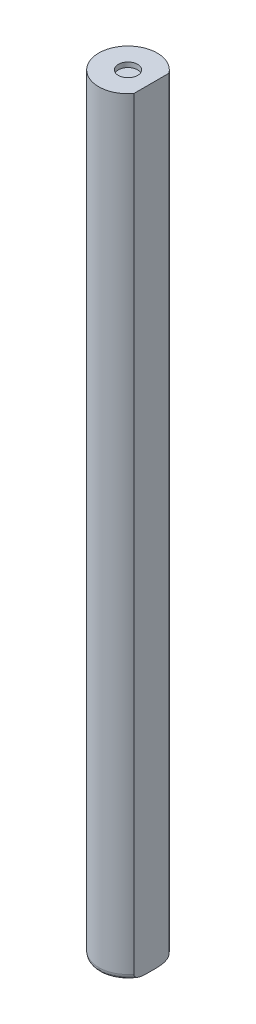
ISO-10303-21;
HEADER;
FILE_DESCRIPTION(('STEP AP214'),'2;1');
FILE_NAME('part.step','',(''),(''),'','','');
FILE_SCHEMA(('AUTOMOTIVE_DESIGN { 1 0 10303 214 1 1 1 1 }'));
ENDSEC;
DATA;
#1=APPLICATION_CONTEXT('core data for automotive mechanical design processes');
#2=APPLICATION_PROTOCOL_DEFINITION('international standard','automotive_design',2000,#1);
#3=PRODUCT_CONTEXT('',#1,'mechanical');
#4=PRODUCT('Part','Part','',(#3));
#5=PRODUCT_RELATED_PRODUCT_CATEGORY('part','',(#4));
#6=PRODUCT_DEFINITION_FORMATION('','',#4);
#7=PRODUCT_DEFINITION_CONTEXT('part definition',#1,'design');
#8=PRODUCT_DEFINITION('design','',#6,#7);
#9=PRODUCT_DEFINITION_SHAPE('','',#8);
#10=(LENGTH_UNIT() NAMED_UNIT(*) SI_UNIT(.MILLI.,.METRE.));
#11=(NAMED_UNIT(*) PLANE_ANGLE_UNIT() SI_UNIT($,.RADIAN.));
#12=(NAMED_UNIT(*) SI_UNIT($,.STERADIAN.) SOLID_ANGLE_UNIT());
#13=UNCERTAINTY_MEASURE_WITH_UNIT(LENGTH_MEASURE(1.E-05),#10,'distance_accuracy_value','');
#14=(GEOMETRIC_REPRESENTATION_CONTEXT(3) GLOBAL_UNCERTAINTY_ASSIGNED_CONTEXT((#13)) GLOBAL_UNIT_ASSIGNED_CONTEXT((#10,
#11,#12)) REPRESENTATION_CONTEXT('',''));
#15=CARTESIAN_POINT('',(0.,0.,0.));
#16=DIRECTION('',(0.,0.,1.));
#17=DIRECTION('',(1.,0.,0.));
#18=AXIS2_PLACEMENT_3D('',#15,#16,#17);
#19=CARTESIAN_POINT('',(-0.8349,30.15,-0.8349));
#20=DIRECTION('',(0.,1.,0.));
#21=DIRECTION('',(0.,0.,1.));
#22=AXIS2_PLACEMENT_3D('',#19,#20,#21);
#23=PLANE('',#22);
#24=CARTESIAN_POINT('',(0.,30.15,0.));
#25=DIRECTION('',(0.,1.,0.));
#26=DIRECTION('',(-1.,0.,0.));
#27=AXIS2_PLACEMENT_3D('',#24,#25,#26);
#28=CIRCLE('',#27,0.825);
#29=CARTESIAN_POINT('',(-0.825,30.15,0.));
#30=VERTEX_POINT('',#29);
#31=EDGE_CURVE('E21',#30,#30,#28,.F.);
#32=ORIENTED_EDGE('',*,*,#31,.F.);
#33=EDGE_LOOP('',(#32));
#34=FACE_BOUND('',#33,.T.);
#35=ADVANCED_FACE('F17',(#34),#23,.T.);
#36=CARTESIAN_POINT('',(-0.8349,-30.15,0.8349));
#37=DIRECTION('',(0.,-1.,0.));
#38=DIRECTION('',(0.,0.,-1.));
#39=AXIS2_PLACEMENT_3D('',#36,#37,#38);
#40=PLANE('',#39);
#41=CARTESIAN_POINT('',(0.,-30.15,0.));
#42=DIRECTION('',(0.,-1.,0.));
#43=DIRECTION('',(1.,0.,0.));
#44=AXIS2_PLACEMENT_3D('',#41,#42,#43);
#45=CIRCLE('',#44,0.825);
#46=CARTESIAN_POINT('',(0.825,-30.15,0.));
#47=VERTEX_POINT('',#46);
#48=EDGE_CURVE('E69',#47,#47,#45,.F.);
#49=ORIENTED_EDGE('',*,*,#48,.F.);
#50=EDGE_LOOP('',(#49));
#51=FACE_BOUND('',#50,.T.);
#52=ADVANCED_FACE('F234',(#51),#40,.T.);
#53=CARTESIAN_POINT('',(0.,30.15,0.));
#54=DIRECTION('',(0.,1.,0.));
#55=DIRECTION('',(-1.,0.,0.));
#56=AXIS2_PLACEMENT_3D('',#53,#54,#55);
#57=CYLINDRICAL_SURFACE('',#56,0.825);
#58=ORIENTED_EDGE('',*,*,#31,.T.);
#59=EDGE_LOOP('',(#58));
#60=FACE_BOUND('',#59,.T.);
#61=CARTESIAN_POINT('',(0.,30.564087739,0.));
#62=DIRECTION('',(0.,1.,0.));
#63=DIRECTION('',(-1.,0.,0.));
#64=AXIS2_PLACEMENT_3D('',#61,#62,#63);
#65=CIRCLE('',#64,0.825);
#66=CARTESIAN_POINT('',(-0.824999999999999,30.564087739,0.));
#67=VERTEX_POINT('',#66);
#68=EDGE_CURVE('E129',#67,#67,#65,.T.);
#69=ORIENTED_EDGE('',*,*,#68,.T.);
#70=EDGE_LOOP('',(#69));
#71=FACE_BOUND('',#70,.T.);
#72=ADVANCED_FACE('F228',(#60,#71),#57,.F.);
#73=CARTESIAN_POINT('',(2.,-35.565071166,-1.5));
#74=DIRECTION('',(-1.,0.,0.));
#75=DIRECTION('',(0.,0.,1.));
#76=AXIS2_PLACEMENT_3D('',#73,#74,#75);
#77=PLANE('',#76);
#78=DIRECTION('',(0.,0.,1.));
#79=VECTOR('',#78,1.);
#80=CARTESIAN_POINT('',(2.,30.564087739,0.));
#81=LINE('',#80,#79);
#82=CARTESIAN_POINT('',(1.99999999999879,30.564087739,-1.50000000000161));
#83=VERTEX_POINT('',#82);
#84=CARTESIAN_POINT('',(1.99999999969114,30.564087739,1.50000000041182));
#85=VERTEX_POINT('',#84);
#86=EDGE_CURVE('E132',#83,#85,#81,.T.);
#87=ORIENTED_EDGE('',*,*,#86,.T.);
#88=DIRECTION('',(0.,1.,0.));
#89=VECTOR('',#88,1.);
#90=CARTESIAN_POINT('',(1.99999999938227,-2.0429561305,1.50000000082364));
#91=LINE('',#90,#89);
#92=CARTESIAN_POINT('',(1.99999999969114,-34.650000000277,1.5000000004299));
#93=VERTEX_POINT('',#92);
#94=EDGE_CURVE('E57',#85,#93,#91,.F.);
#95=ORIENTED_EDGE('',*,*,#94,.T.);
#96=CARTESIAN_POINT('',(2.,-35.15,0.));
#97=CARTESIAN_POINT('',(2.,-35.1499973748319,0.0265296691538286));
#98=CARTESIAN_POINT('',(2.,-35.150000350175,0.0530592825620455));
#99=CARTESIAN_POINT('',(2.,-35.1499946381844,0.106118772319396));
#100=CARTESIAN_POINT('',(2.,-35.1499859507339,0.132648648668499));
#101=CARTESIAN_POINT('',(2.,-35.1499075649639,0.212782874046923));
#102=CARTESIAN_POINT('',(2.,-35.1497846514025,0.266387385882318));
#103=CARTESIAN_POINT('',(2.,-35.1489184940871,0.373837047202513));
#104=CARTESIAN_POINT('',(2.,-35.1481724270548,0.427682180514275));
#105=CARTESIAN_POINT('',(2.,-35.1451560814967,0.539742722369725));
#106=CARTESIAN_POINT('',(2.,-35.1427662842343,0.597955864954052));
#107=CARTESIAN_POINT('',(2.,-35.1350097758184,0.713977971346417));
#108=CARTESIAN_POINT('',(2.,-35.1296544792164,0.771787629540953));
#109=CARTESIAN_POINT('',(2.,-35.1142622637153,0.886672370363475));
#110=CARTESIAN_POINT('',(2.,-35.1042407692992,0.94374924129938));
#111=CARTESIAN_POINT('',(2.,-35.0849399763858,1.02430218548419));
#112=CARTESIAN_POINT('',(2.00000000000001,-35.0784719335315,1.04845017570847));
#113=CARTESIAN_POINT('',(1.99999999999999,-35.0640113210926,1.09631140173867));
#114=CARTESIAN_POINT('',(1.99999999999997,-35.0560176594493,1.1200243126995));
#115=CARTESIAN_POINT('',(2.00000000000003,-35.0383620986888,1.16653041887575));
#116=CARTESIAN_POINT('',(2.0000000000001,-35.028719547115,1.18933086810563));
#117=CARTESIAN_POINT('',(1.9999999999999,-35.0074519855615,1.23397503342595));
#118=CARTESIAN_POINT('',(1.99999999999964,-34.9958287901944,1.25581960244793));
#119=CARTESIAN_POINT('',(1.99999999999962,-34.9697407837417,1.29911839128748));
#120=CARTESIAN_POINT('',(1.9999999999999,-34.9551715345356,1.32051067565466));
#121=CARTESIAN_POINT('',(2.0000000000001,-34.923243238202,1.3611639730037));
#122=CARTESIAN_POINT('',(2.00000000000002,-34.9058832492352,1.38042426274581));
#123=CARTESIAN_POINT('',(1.99999999999998,-34.8712605713702,1.41296218592201));
#124=CARTESIAN_POINT('',(1.99999999999999,-34.8544380370302,1.4267035275781));
#125=CARTESIAN_POINT('',(2.00000000000001,-34.8187659687525,1.4512668021174));
#126=CARTESIAN_POINT('',(2.,-34.7999187954989,1.46209208447374));
#127=CARTESIAN_POINT('',(1.99999999999999,-34.7641043849037,1.47839993924313));
#128=CARTESIAN_POINT('',(1.99999999999999,-34.7474173324115,1.48449575367811));
#129=CARTESIAN_POINT('',(2.00000000000001,-34.7132761960652,1.49379443620461));
#130=CARTESIAN_POINT('',(2.00000000000004,-34.6958239919873,1.49700401855121));
#131=CARTESIAN_POINT('',(1.99999999999998,-34.6688501515603,1.49955870939121));
#132=CARTESIAN_POINT('',(1.99999999999995,-34.6594235919852,1.50000777377347));
#133=CARTESIAN_POINT('',(1.99999999999988,-34.6500000005539,1.50000000003623));
#134=B_SPLINE_CURVE_WITH_KNOTS('',3,(#96,#97,#98,#99,#100,#101,#102,#103,#104,#105,#106,#107,
#108,#109,#110,#111,#112,#113,#114,#115,#116,#117,#118,#119,#120,#121,#122,#123,#124,#125,#126,
#127,#128,#129,#130,#131,#132,#133),.UNSPECIFIED.,.F.,.F.,(4,2,2,2,2,2,2,2,2,2,2,2,2,2,2,2,2,2,
4),(0.,0.0795888945441585,0.159178586704959,0.319991282718455,0.481536538844484,
0.656276652448952,0.830348799826878,1.0038495791647,1.0788076496339,1.15381957872368,
1.22800516865121,1.30212315360286,1.37958067575754,1.45706439393586,1.52199124205137,
1.5868431921278,1.63991765483916,1.69286832836304,1.72113845899334),.UNSPECIFIED.);
#135=CARTESIAN_POINT('',(1.9999999996251,-35.1499999984148,0.));
#136=VERTEX_POINT('',#135);
#137=EDGE_CURVE('E60',#136,#93,#134,.T.);
#138=ORIENTED_EDGE('',*,*,#137,.F.);
#139=CARTESIAN_POINT('',(2.,-34.6500000005539,-1.50000000003615));
#140=CARTESIAN_POINT('',(2.,-34.6599948327778,-1.50000228650955));
#141=CARTESIAN_POINT('',(2.,-34.6699828286215,-1.4995000445694));
#142=CARTESIAN_POINT('',(2.,-34.6898511505919,-1.49751290791094));
#143=CARTESIAN_POINT('',(2.,-34.6997315711314,-1.49602895983524));
#144=CARTESIAN_POINT('',(2.,-34.7288852872338,-1.49018557466679));
#145=CARTESIAN_POINT('',(2.,-34.7478933742187,-1.48443328458527));
#146=CARTESIAN_POINT('',(2.,-34.7845021945256,-1.46971009500002));
#147=CARTESIAN_POINT('',(2.,-34.8021076658047,-1.46075064642023));
#148=CARTESIAN_POINT('',(2.,-34.8357413554394,-1.44019068427704));
#149=CARTESIAN_POINT('',(2.,-34.8517651739187,-1.42858308507846));
#150=CARTESIAN_POINT('',(2.,-34.8889335087197,-1.39760918244545));
#151=CARTESIAN_POINT('',(2.,-34.9091256667766,-1.37710543687427));
#152=CARTESIAN_POINT('',(2.,-34.9460210343716,-1.33321406001512));
#153=CARTESIAN_POINT('',(2.,-34.9627204075466,-1.30982330208332));
#154=CARTESIAN_POINT('',(2.,-34.9901996291985,-1.26567928594746));
#155=CARTESIAN_POINT('',(2.,-35.001502782732,-1.24524457623084));
#156=CARTESIAN_POINT('',(2.,-35.0222995510373,-1.20346308467402));
#157=CARTESIAN_POINT('',(2.,-35.0317917925876,-1.18211562558944));
#158=CARTESIAN_POINT('',(2.,-35.0492633250028,-1.13858465747921));
#159=CARTESIAN_POINT('',(2.,-35.0572275462186,-1.11639517348735));
#160=CARTESIAN_POINT('',(2.,-35.071736136908,-1.07158076059455));
#161=CARTESIAN_POINT('',(2.,-35.0782815321358,-1.04895615923645));
#162=CARTESIAN_POINT('',(2.,-35.0992109347844,-0.968677769395449));
#163=CARTESIAN_POINT('',(2.,-35.1103424464791,-0.910176666887891));
#164=CARTESIAN_POINT('',(2.,-35.1274374222635,-0.792295550748619));
#165=CARTESIAN_POINT('',(2.,-35.1333805438064,-0.732912997730389));
#166=CARTESIAN_POINT('',(2.,-35.1419892062176,-0.613661710079348));
#167=CARTESIAN_POINT('',(2.,-35.1446398008429,-0.553791991269906));
#168=CARTESIAN_POINT('',(2.,-35.1479803344867,-0.43862620006697));
#169=CARTESIAN_POINT('',(2.,-35.1488055109526,-0.383332871621076));
#170=CARTESIAN_POINT('',(2.,-35.1497626032388,-0.273037301993217));
#171=CARTESIAN_POINT('',(2.,-35.1498981990641,-0.218035083794488));
#172=CARTESIAN_POINT('',(2.,-35.1499845384152,-0.135860741575506));
#173=CARTESIAN_POINT('',(2.,-35.1499940985568,-0.108688416277926));
#174=CARTESIAN_POINT('',(2.,-35.1500003866772,-0.0543440834690096));
#175=CARTESIAN_POINT('',(2.,-35.1499971148076,-0.0271720759577138));
#176=CARTESIAN_POINT('',(2.,-35.15,0.));
#177=B_SPLINE_CURVE_WITH_KNOTS('',3,(#139,#140,#141,#142,#143,#144,#145,#146,#147,#148,#149,
#150,#151,#152,#153,#154,#155,#156,#157,#158,#159,#160,#161,#162,#163,#164,#165,#166,#167,#168,
#169,#170,#171,#172,#173,#174,#175,#176),.UNSPECIFIED.,.F.,.F.,(4,2,2,2,2,2,2,2,2,2,2,2,2,2,2,2,
2,2,4),(0.,0.0299590488165881,0.0598892506563785,0.11909413100987,0.178089699265009,
0.237245012345497,0.323095414919121,0.409039623301985,0.478999672042764,0.549012562708301,
0.619683954450262,0.690304081938238,0.868528073053722,1.04744774315994,1.2271766757427,
1.39306852483215,1.55807414220002,1.63959119524808,1.72110728454276),.UNSPECIFIED.);
#178=CARTESIAN_POINT('',(1.99999999999879,-34.650000000277,-1.50000000001969));
#179=VERTEX_POINT('',#178);
#180=EDGE_CURVE('E64',#179,#136,#177,.T.);
#181=ORIENTED_EDGE('',*,*,#180,.F.);
#182=DIRECTION('',(0.,-1.,0.));
#183=VECTOR('',#182,1.);
#184=CARTESIAN_POINT('',(1.99999999999758,-2.0429561305,-1.50000000000322));
#185=LINE('',#184,#183);
#186=EDGE_CURVE('E96',#179,#83,#185,.F.);
#187=ORIENTED_EDGE('',*,*,#186,.T.);
#188=EDGE_LOOP('',(#87,#95,#138,#181,#187));
#189=FACE_BOUND('',#188,.T.);
#190=ADVANCED_FACE('F62',(#189),#77,.F.);
#191=CARTESIAN_POINT('',(0.,-35.15,-2.));
#192=CARTESIAN_POINT('',(1.180346711,-35.15,-2.));
#193=CARTESIAN_POINT('',(2.011035515,-35.15,-1.161445012));
#194=CARTESIAN_POINT('',(1.999911174,-35.15,0.018849277));
#195=CARTESIAN_POINT('',(0.,-35.15,-2.292893219));
#196=CARTESIAN_POINT('',(1.353204485,-35.15,-2.292893219));
#197=CARTESIAN_POINT('',(2.305544848,-35.15,-1.331534695));
#198=CARTESIAN_POINT('',(2.292791385,-35.15,0.02160969));
#199=CARTESIAN_POINT('',(0.,-34.942893219,-2.5));
#200=CARTESIAN_POINT('',(1.475433389,-34.942893219,-2.5));
#201=CARTESIAN_POINT('',(2.513794394,-34.942893219,-1.451806264));
#202=CARTESIAN_POINT('',(2.499888968,-34.942893219,0.023561596));
#203=CARTESIAN_POINT('',(0.,-34.65,-2.5));
#204=CARTESIAN_POINT('',(1.475433389,-34.65,-2.5));
#205=CARTESIAN_POINT('',(2.513794394,-34.65,-1.451806264));
#206=CARTESIAN_POINT('',(2.499888968,-34.65,0.023561596));
#207=(BOUNDED_SURFACE() B_SPLINE_SURFACE(3,3,((#191,#192,#193,#194),(#195,#196,#197,#198),(#199,
#200,#201,#202),(#203,#204,#205,#206)),.UNSPECIFIED.,.F.,.F.,
.F.) B_SPLINE_SURFACE_WITH_KNOTS((4,4),(4,4),(0.,1.),(0.,1.),
.UNSPECIFIED.) GEOMETRIC_REPRESENTATION_ITEM() RATIONAL_B_SPLINE_SURFACE(((1.,0.802511186738594,
0.802511186738594,1.),(0.804737854124365,0.645811130326813,0.645811130326813,0.804737854124365),
(0.804737854124365,0.645811130326813,0.645811130326813,0.804737854124365),(1.,0.802511186738594,
0.802511186738594,1.))) REPRESENTATION_ITEM('') SURFACE());
#208=CARTESIAN_POINT('',(0.,-34.65,0.));
#209=DIRECTION('',(0.,-1.,0.));
#210=DIRECTION('',(0.,0.,-1.));
#211=AXIS2_PLACEMENT_3D('',#208,#209,#210);
#212=CIRCLE('',#211,2.5);
#213=CARTESIAN_POINT('',(-2.24484071071833E-10,-34.65,-2.5));
#214=VERTEX_POINT('',#213);
#215=EDGE_CURVE('E77',#214,#179,#212,.T.);
#216=CARTESIAN_POINT('',(1.99991117400955,-35.15,0.0188492770000901));
#217=CARTESIAN_POINT('',(2.01103551500961,-35.15,-1.16144501200555));
#218=CARTESIAN_POINT('',(1.18034671100564,-35.15,-2.00000000000956));
#219=CARTESIAN_POINT('',(0.,-35.15,-2.00000000000956));
#220=(BOUNDED_CURVE() B_SPLINE_CURVE(3,(#216,#217,#218,#219),.UNSPECIFIED.,.F.,
.F.) B_SPLINE_CURVE_WITH_KNOTS((4,4),(0.,1.),
.UNSPECIFIED.) CURVE() GEOMETRIC_REPRESENTATION_ITEM() RATIONAL_B_SPLINE_CURVE((0.999999999992084,
0.802511186732241,0.802511186732241,0.999999999992084)) REPRESENTATION_ITEM(''));
#221=CARTESIAN_POINT('',(-6.83622602970502E-10,-35.15,-1.99999999958891));
#222=VERTEX_POINT('',#221);
#223=EDGE_CURVE('E74',#222,#136,#220,.F.);
#224=CARTESIAN_POINT('',(0.,-34.65,-2.));
#225=DIRECTION('',(1.,0.,0.));
#226=DIRECTION('',(0.,0.,-1.));
#227=AXIS2_PLACEMENT_3D('',#224,#225,#226);
#228=CIRCLE('',#227,0.5);
#229=EDGE_CURVE('E36',#222,#214,#228,.T.);
#230=ORIENTED_EDGE('',*,*,#215,.T.);
#231=ORIENTED_EDGE('',*,*,#180,.T.);
#232=ORIENTED_EDGE('',*,*,#223,.F.);
#233=ORIENTED_EDGE('',*,*,#229,.T.);
#234=EDGE_LOOP('',(#230,#231,#232,#233));
#235=FACE_BOUND('',#234,.T.);
#236=ADVANCED_FACE('F72',(#235),#207,.T.);
#237=CARTESIAN_POINT('',(1.999911174,-35.15,-0.018849277));
#238=CARTESIAN_POINT('',(2.011035515,-35.15,1.161445012));
#239=CARTESIAN_POINT('',(1.180346711,-35.15,2.));
#240=CARTESIAN_POINT('',(0.,-35.15,2.));
#241=CARTESIAN_POINT('',(2.292791385,-35.15,-0.02160969));
#242=CARTESIAN_POINT('',(2.305544848,-35.15,1.331534695));
#243=CARTESIAN_POINT('',(1.353204485,-35.15,2.292893219));
#244=CARTESIAN_POINT('',(0.,-35.15,2.292893219));
#245=CARTESIAN_POINT('',(2.499888968,-34.942893219,-0.023561596));
#246=CARTESIAN_POINT('',(2.513794394,-34.942893219,1.451806264));
#247=CARTESIAN_POINT('',(1.475433389,-34.942893219,2.5));
#248=CARTESIAN_POINT('',(0.,-34.942893219,2.5));
#249=CARTESIAN_POINT('',(2.499888968,-34.65,-0.023561596));
#250=CARTESIAN_POINT('',(2.513794394,-34.65,1.451806264));
#251=CARTESIAN_POINT('',(1.475433389,-34.65,2.5));
#252=CARTESIAN_POINT('',(0.,-34.65,2.5));
#253=(BOUNDED_SURFACE() B_SPLINE_SURFACE(3,3,((#237,#238,#239,#240),(#241,#242,#243,#244),(#245,
#246,#247,#248),(#249,#250,#251,#252)),.UNSPECIFIED.,.F.,.F.,
.F.) B_SPLINE_SURFACE_WITH_KNOTS((4,4),(4,4),(0.,1.),(0.,1.),
.UNSPECIFIED.) GEOMETRIC_REPRESENTATION_ITEM() RATIONAL_B_SPLINE_SURFACE(((1.,0.802511186738594,
0.802511186738594,1.),(0.804737854124365,0.645811130326813,0.645811130326813,0.804737854124365),
(0.804737854124365,0.645811130326813,0.645811130326813,0.804737854124365),(1.,0.802511186738594,
0.802511186738594,1.))) REPRESENTATION_ITEM('') SURFACE());
#254=CARTESIAN_POINT('',(0.,-34.65,0.));
#255=DIRECTION('',(0.,-1.,0.));
#256=DIRECTION('',(0.,0.,-1.));
#257=AXIS2_PLACEMENT_3D('',#254,#255,#256);
#258=CIRCLE('',#257,2.5);
#259=CARTESIAN_POINT('',(-6.4094821411041E-10,-34.65,2.5));
#260=VERTEX_POINT('',#259);
#261=EDGE_CURVE('E93',#93,#260,#258,.T.);
#262=CARTESIAN_POINT('',(0.,-34.65,2.));
#263=DIRECTION('',(1.,0.,0.));
#264=DIRECTION('',(0.,0.,-1.));
#265=AXIS2_PLACEMENT_3D('',#262,#263,#264);
#266=CIRCLE('',#265,0.5);
#267=CARTESIAN_POINT('',(-6.83622602970502E-10,-35.15,1.99999999959163));
#268=VERTEX_POINT('',#267);
#269=EDGE_CURVE('E70',#260,#268,#266,.T.);
#270=CARTESIAN_POINT('',(0.,-35.15,2.00000000002314));
#271=CARTESIAN_POINT('',(1.18034671101366,-35.15,2.00000000002314));
#272=CARTESIAN_POINT('',(2.01103551502327,-35.15,1.16144501201344));
#273=CARTESIAN_POINT('',(1.99991117402314,-35.15,-0.0188492770002181));
#274=(BOUNDED_CURVE() B_SPLINE_CURVE(3,(#270,#271,#272,#273),.UNSPECIFIED.,.F.,
.F.) B_SPLINE_CURVE_WITH_KNOTS((4,4),(0.,1.),
.UNSPECIFIED.) CURVE() GEOMETRIC_REPRESENTATION_ITEM() RATIONAL_B_SPLINE_CURVE((0.99999999998083,
0.80251118672321,0.80251118672321,0.99999999998083)) REPRESENTATION_ITEM(''));
#275=EDGE_CURVE('E82',#136,#268,#274,.F.);
#276=ORIENTED_EDGE('',*,*,#137,.T.);
#277=ORIENTED_EDGE('',*,*,#261,.T.);
#278=ORIENTED_EDGE('',*,*,#269,.T.);
#279=ORIENTED_EDGE('',*,*,#275,.F.);
#280=EDGE_LOOP('',(#276,#277,#278,#279));
#281=FACE_BOUND('',#280,.T.);
#282=ADVANCED_FACE('F84',(#281),#253,.T.);
#283=CARTESIAN_POINT('',(0.,-30.15,0.));
#284=DIRECTION('',(0.,-1.,0.));
#285=DIRECTION('',(1.,0.,0.));
#286=AXIS2_PLACEMENT_3D('',#283,#284,#285);
#287=CYLINDRICAL_SURFACE('',#286,0.825);
#288=ORIENTED_EDGE('',*,*,#48,.T.);
#289=EDGE_LOOP('',(#288));
#290=FACE_BOUND('',#289,.T.);
#291=CARTESIAN_POINT('',(0.,-35.15,0.));
#292=DIRECTION('',(0.,-1.,0.));
#293=DIRECTION('',(1.,0.,0.));
#294=AXIS2_PLACEMENT_3D('',#291,#292,#293);
#295=CIRCLE('',#294,0.825);
#296=CARTESIAN_POINT('',(0.825000000000011,-35.15,0.));
#297=VERTEX_POINT('',#296);
#298=EDGE_CURVE('E88',#297,#297,#295,.F.);
#299=ORIENTED_EDGE('',*,*,#298,.F.);
#300=EDGE_LOOP('',(#299));
#301=FACE_BOUND('',#300,.T.);
#302=ADVANCED_FACE('F148',(#290,#301),#287,.F.);
#303=CARTESIAN_POINT('',(-2.527,30.564087739,2.53));
#304=DIRECTION('',(0.,-1.,0.));
#305=DIRECTION('',(0.,0.,-1.));
#306=AXIS2_PLACEMENT_3D('',#303,#304,#305);
#307=PLANE('',#306);
#308=ORIENTED_EDGE('',*,*,#68,.F.);
#309=EDGE_LOOP('',(#308));
#310=FACE_BOUND('',#309,.T.);
#311=CARTESIAN_POINT('',(0.,30.564087739,0.));
#312=DIRECTION('',(0.,-1.,0.));
#313=DIRECTION('',(1.,0.,0.));
#314=AXIS2_PLACEMENT_3D('',#311,#312,#313);
#315=CIRCLE('',#314,2.5);
#316=EDGE_CURVE('E123',#83,#85,#315,.F.);
#317=ORIENTED_EDGE('',*,*,#316,.T.);
#318=ORIENTED_EDGE('',*,*,#86,.F.);
#319=EDGE_LOOP('',(#317,#318));
#320=FACE_BOUND('',#319,.T.);
#321=ADVANCED_FACE('F110',(#310,#320),#307,.F.);
#322=CARTESIAN_POINT('',(-2.024050818,-35.15,2.024));
#323=DIRECTION('',(0.,-1.,0.));
#324=DIRECTION('',(0.,0.,-1.));
#325=AXIS2_PLACEMENT_3D('',#322,#323,#324);
#326=PLANE('',#325);
#327=ORIENTED_EDGE('',*,*,#298,.T.);
#328=EDGE_LOOP('',(#327));
#329=FACE_BOUND('',#328,.T.);
#330=ORIENTED_EDGE('',*,*,#223,.T.);
#331=ORIENTED_EDGE('',*,*,#275,.T.);
#332=CARTESIAN_POINT('',(0.,-35.15,0.));
#333=DIRECTION('',(0.,-1.,0.));
#334=DIRECTION('',(0.,0.,-1.));
#335=AXIS2_PLACEMENT_3D('',#332,#333,#334);
#336=CIRCLE('',#335,2.);
#337=EDGE_CURVE('E27',#222,#268,#336,.F.);
#338=ORIENTED_EDGE('',*,*,#337,.F.);
#339=EDGE_LOOP('',(#330,#331,#338));
#340=FACE_BOUND('',#339,.T.);
#341=ADVANCED_FACE('F92',(#329,#340),#326,.T.);
#342=CARTESIAN_POINT('',(0.,30.564087739,0.));
#343=DIRECTION('',(0.,-1.,0.));
#344=DIRECTION('',(1.,0.,0.));
#345=AXIS2_PLACEMENT_3D('',#342,#343,#344);
#346=CYLINDRICAL_SURFACE('',#345,2.5);
#347=ORIENTED_EDGE('',*,*,#316,.F.);
#348=ORIENTED_EDGE('',*,*,#186,.F.);
#349=ORIENTED_EDGE('',*,*,#215,.F.);
#350=CARTESIAN_POINT('',(0.,-34.65,0.));
#351=DIRECTION('',(0.,-1.,0.));
#352=DIRECTION('',(0.,0.,-1.));
#353=AXIS2_PLACEMENT_3D('',#350,#351,#352);
#354=CIRCLE('',#353,2.5);
#355=EDGE_CURVE('E11',#260,#214,#354,.T.);
#356=ORIENTED_EDGE('',*,*,#355,.F.);
#357=ORIENTED_EDGE('',*,*,#261,.F.);
#358=ORIENTED_EDGE('',*,*,#94,.F.);
#359=EDGE_LOOP('',(#347,#348,#349,#356,#357,#358));
#360=FACE_BOUND('',#359,.T.);
#361=ADVANCED_FACE('F109',(#360),#346,.T.);
#362=CARTESIAN_POINT('',(0.,-34.65,0.));
#363=DIRECTION('',(0.,-1.,0.));
#364=DIRECTION('',(0.,0.,-1.));
#365=AXIS2_PLACEMENT_3D('',#362,#363,#364);
#366=TOROIDAL_SURFACE('',#365,2.,0.5);
#367=ORIENTED_EDGE('',*,*,#355,.T.);
#368=ORIENTED_EDGE('',*,*,#229,.F.);
#369=ORIENTED_EDGE('',*,*,#337,.T.);
#370=ORIENTED_EDGE('',*,*,#269,.F.);
#371=EDGE_LOOP('',(#367,#368,#369,#370));
#372=FACE_BOUND('',#371,.T.);
#373=ADVANCED_FACE('F19',(#372),#366,.T.);
#374=CLOSED_SHELL('',(#35,#52,#72,#190,#236,#282,#302,#321,#341,#361,#373));
#375=MANIFOLD_SOLID_BREP('B1',#374);
#376=ADVANCED_BREP_SHAPE_REPRESENTATION('',(#18,#375),#14);
#377=SHAPE_DEFINITION_REPRESENTATION(#9,#376);
ENDSEC;
END-ISO-10303-21;
